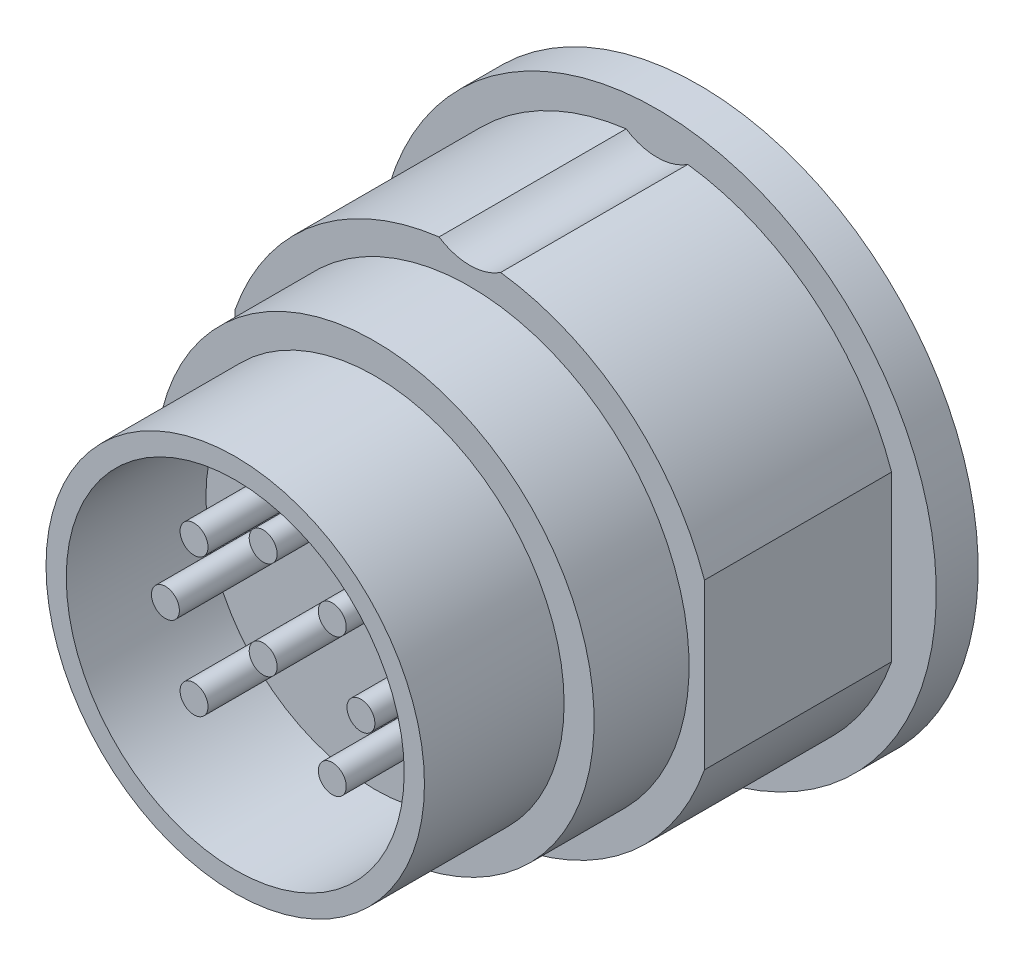
ISO-10303-21;
HEADER;
FILE_DESCRIPTION(('STEP AP214'),'2;1');
FILE_NAME('part.step','',(''),(''),'','','');
FILE_SCHEMA(('AUTOMOTIVE_DESIGN { 1 0 10303 214 1 1 1 1 }'));
ENDSEC;
DATA;
#1=APPLICATION_CONTEXT('core data for automotive mechanical design processes');
#2=APPLICATION_PROTOCOL_DEFINITION('international standard','automotive_design',2000,#1);
#3=PRODUCT_CONTEXT('',#1,'mechanical');
#4=PRODUCT('Part','Part','',(#3));
#5=PRODUCT_RELATED_PRODUCT_CATEGORY('part','',(#4));
#6=PRODUCT_DEFINITION_FORMATION('','',#4);
#7=PRODUCT_DEFINITION_CONTEXT('part definition',#1,'design');
#8=PRODUCT_DEFINITION('design','',#6,#7);
#9=PRODUCT_DEFINITION_SHAPE('','',#8);
#10=(LENGTH_UNIT() NAMED_UNIT(*) SI_UNIT(.MILLI.,.METRE.));
#11=(NAMED_UNIT(*) PLANE_ANGLE_UNIT() SI_UNIT($,.RADIAN.));
#12=(NAMED_UNIT(*) SI_UNIT($,.STERADIAN.) SOLID_ANGLE_UNIT());
#13=UNCERTAINTY_MEASURE_WITH_UNIT(LENGTH_MEASURE(1.E-05),#10,'distance_accuracy_value','');
#14=(GEOMETRIC_REPRESENTATION_CONTEXT(3) GLOBAL_UNCERTAINTY_ASSIGNED_CONTEXT((#13)) GLOBAL_UNIT_ASSIGNED_CONTEXT((#10,
#11,#12)) REPRESENTATION_CONTEXT('',''));
#15=CARTESIAN_POINT('',(0.,0.,0.));
#16=DIRECTION('',(0.,0.,1.));
#17=DIRECTION('',(1.,0.,0.));
#18=AXIS2_PLACEMENT_3D('',#15,#16,#17);
#19=CARTESIAN_POINT('',(0.,0.,4.55));
#20=DIRECTION('',(0.,0.,-1.));
#21=DIRECTION('',(1.,0.,0.));
#22=AXIS2_PLACEMENT_3D('',#19,#20,#21);
#23=CYLINDRICAL_SURFACE('',#22,0.5);
#24=CARTESIAN_POINT('',(0.,0.,-0.45));
#25=DIRECTION('',(0.,0.,1.));
#26=DIRECTION('',(1.,0.,0.));
#27=AXIS2_PLACEMENT_3D('',#24,#25,#26);
#28=CIRCLE('',#27,0.5);
#29=CARTESIAN_POINT('',(0.5,0.,-0.45));
#30=VERTEX_POINT('',#29);
#31=EDGE_CURVE('E11',#30,#30,#28,.T.);
#32=ORIENTED_EDGE('',*,*,#31,.T.);
#33=EDGE_LOOP('',(#32));
#34=FACE_BOUND('',#33,.T.);
#35=CARTESIAN_POINT('',(0.,0.,4.55));
#36=DIRECTION('',(0.,0.,1.));
#37=DIRECTION('',(1.,0.,0.));
#38=AXIS2_PLACEMENT_3D('',#35,#36,#37);
#39=CIRCLE('',#38,0.5);
#40=CARTESIAN_POINT('',(0.5,0.,4.55));
#41=VERTEX_POINT('',#40);
#42=EDGE_CURVE('E109',#41,#41,#39,.T.);
#43=ORIENTED_EDGE('',*,*,#42,.F.);
#44=EDGE_LOOP('',(#43));
#45=FACE_BOUND('',#44,.T.);
#46=ADVANCED_FACE('F17',(#34,#45),#23,.T.);
#47=CARTESIAN_POINT('',(0.,0.,-0.45));
#48=DIRECTION('',(0.,0.,1.));
#49=DIRECTION('',(1.,0.,0.));
#50=AXIS2_PLACEMENT_3D('',#47,#48,#49);
#51=PLANE('',#50);
#52=ORIENTED_EDGE('',*,*,#31,.F.);
#53=EDGE_LOOP('',(#52));
#54=FACE_BOUND('',#53,.T.);
#55=ADVANCED_FACE('F173',(#54),#51,.F.);
#56=CARTESIAN_POINT('',(2.47487373415292,-2.47487373415292,4.55));
#57=DIRECTION('',(0.,0.,-1.));
#58=DIRECTION('',(1.,0.,0.));
#59=AXIS2_PLACEMENT_3D('',#56,#57,#58);
#60=CYLINDRICAL_SURFACE('',#59,0.5);
#61=CARTESIAN_POINT('',(2.47487373415292,-2.47487373415292,-0.45));
#62=DIRECTION('',(0.,0.,1.));
#63=DIRECTION('',(1.,0.,0.));
#64=AXIS2_PLACEMENT_3D('',#61,#62,#63);
#65=CIRCLE('',#64,0.5);
#66=CARTESIAN_POINT('',(2.97487373415292,-2.47487373415292,-0.45));
#67=VERTEX_POINT('',#66);
#68=EDGE_CURVE('E27',#67,#67,#65,.T.);
#69=ORIENTED_EDGE('',*,*,#68,.T.);
#70=EDGE_LOOP('',(#69));
#71=FACE_BOUND('',#70,.T.);
#72=CARTESIAN_POINT('',(2.47487373415292,-2.47487373415292,4.55));
#73=DIRECTION('',(0.,0.,1.));
#74=DIRECTION('',(1.,0.,0.));
#75=AXIS2_PLACEMENT_3D('',#72,#73,#74);
#76=CIRCLE('',#75,0.5);
#77=CARTESIAN_POINT('',(2.97487373415292,-2.47487373415292,4.55));
#78=VERTEX_POINT('',#77);
#79=EDGE_CURVE('E356',#78,#78,#76,.T.);
#80=ORIENTED_EDGE('',*,*,#79,.F.);
#81=EDGE_LOOP('',(#80));
#82=FACE_BOUND('',#81,.T.);
#83=ADVANCED_FACE('F179',(#71,#82),#60,.T.);
#84=CARTESIAN_POINT('',(2.47487373415292,-2.47487373415292,-0.45));
#85=DIRECTION('',(0.,0.,1.));
#86=DIRECTION('',(1.,0.,0.));
#87=AXIS2_PLACEMENT_3D('',#84,#85,#86);
#88=PLANE('',#87);
#89=ORIENTED_EDGE('',*,*,#68,.F.);
#90=EDGE_LOOP('',(#89));
#91=FACE_BOUND('',#90,.T.);
#92=ADVANCED_FACE('F186',(#91),#88,.F.);
#93=CARTESIAN_POINT('',(3.5,0.,4.55));
#94=DIRECTION('',(0.,0.,-1.));
#95=DIRECTION('',(1.,0.,0.));
#96=AXIS2_PLACEMENT_3D('',#93,#94,#95);
#97=CYLINDRICAL_SURFACE('',#96,0.5);
#98=CARTESIAN_POINT('',(3.5,0.,-0.45));
#99=DIRECTION('',(0.,0.,1.));
#100=DIRECTION('',(1.,0.,0.));
#101=AXIS2_PLACEMENT_3D('',#98,#99,#100);
#102=CIRCLE('',#101,0.5);
#103=CARTESIAN_POINT('',(4.,0.,-0.45));
#104=VERTEX_POINT('',#103);
#105=EDGE_CURVE('E500',#104,#104,#102,.T.);
#106=ORIENTED_EDGE('',*,*,#105,.T.);
#107=EDGE_LOOP('',(#106));
#108=FACE_BOUND('',#107,.T.);
#109=CARTESIAN_POINT('',(3.5,0.,4.55));
#110=DIRECTION('',(0.,0.,1.));
#111=DIRECTION('',(1.,0.,0.));
#112=AXIS2_PLACEMENT_3D('',#109,#110,#111);
#113=CIRCLE('',#112,0.5);
#114=CARTESIAN_POINT('',(4.,0.,4.55));
#115=VERTEX_POINT('',#114);
#116=EDGE_CURVE('E360',#115,#115,#113,.T.);
#117=ORIENTED_EDGE('',*,*,#116,.F.);
#118=EDGE_LOOP('',(#117));
#119=FACE_BOUND('',#118,.T.);
#120=ADVANCED_FACE('F190',(#108,#119),#97,.T.);
#121=CARTESIAN_POINT('',(3.5,0.,-0.45));
#122=DIRECTION('',(0.,0.,1.));
#123=DIRECTION('',(1.,0.,0.));
#124=AXIS2_PLACEMENT_3D('',#121,#122,#123);
#125=PLANE('',#124);
#126=ORIENTED_EDGE('',*,*,#105,.F.);
#127=EDGE_LOOP('',(#126));
#128=FACE_BOUND('',#127,.T.);
#129=ADVANCED_FACE('F194',(#128),#125,.F.);
#130=CARTESIAN_POINT('',(2.47487373415292,2.47487373415292,4.55));
#131=DIRECTION('',(0.,0.,-1.));
#132=DIRECTION('',(1.,0.,0.));
#133=AXIS2_PLACEMENT_3D('',#130,#131,#132);
#134=CYLINDRICAL_SURFACE('',#133,0.5);
#135=CARTESIAN_POINT('',(2.47487373415292,2.47487373415292,-0.45));
#136=DIRECTION('',(0.,0.,1.));
#137=DIRECTION('',(1.,0.,0.));
#138=AXIS2_PLACEMENT_3D('',#135,#136,#137);
#139=CIRCLE('',#138,0.5);
#140=CARTESIAN_POINT('',(2.97487373415292,2.47487373415292,-0.45));
#141=VERTEX_POINT('',#140);
#142=EDGE_CURVE('E496',#141,#141,#139,.T.);
#143=ORIENTED_EDGE('',*,*,#142,.T.);
#144=EDGE_LOOP('',(#143));
#145=FACE_BOUND('',#144,.T.);
#146=CARTESIAN_POINT('',(2.47487373415292,2.47487373415292,4.55));
#147=DIRECTION('',(0.,0.,1.));
#148=DIRECTION('',(1.,0.,0.));
#149=AXIS2_PLACEMENT_3D('',#146,#147,#148);
#150=CIRCLE('',#149,0.5);
#151=CARTESIAN_POINT('',(2.97487373415292,2.47487373415292,4.55));
#152=VERTEX_POINT('',#151);
#153=EDGE_CURVE('E364',#152,#152,#150,.T.);
#154=ORIENTED_EDGE('',*,*,#153,.F.);
#155=EDGE_LOOP('',(#154));
#156=FACE_BOUND('',#155,.T.);
#157=ADVANCED_FACE('F198',(#145,#156),#134,.T.);
#158=CARTESIAN_POINT('',(2.47487373415292,2.47487373415292,-0.45));
#159=DIRECTION('',(0.,0.,1.));
#160=DIRECTION('',(1.,0.,0.));
#161=AXIS2_PLACEMENT_3D('',#158,#159,#160);
#162=PLANE('',#161);
#163=ORIENTED_EDGE('',*,*,#142,.F.);
#164=EDGE_LOOP('',(#163));
#165=FACE_BOUND('',#164,.T.);
#166=ADVANCED_FACE('F202',(#165),#162,.F.);
#167=CARTESIAN_POINT('',(0.,3.5,4.55));
#168=DIRECTION('',(0.,0.,-1.));
#169=DIRECTION('',(1.,0.,0.));
#170=AXIS2_PLACEMENT_3D('',#167,#168,#169);
#171=CYLINDRICAL_SURFACE('',#170,0.5);
#172=CARTESIAN_POINT('',(0.,3.5,-0.45));
#173=DIRECTION('',(0.,0.,1.));
#174=DIRECTION('',(1.,0.,0.));
#175=AXIS2_PLACEMENT_3D('',#172,#173,#174);
#176=CIRCLE('',#175,0.5);
#177=CARTESIAN_POINT('',(0.5,3.5,-0.45));
#178=VERTEX_POINT('',#177);
#179=EDGE_CURVE('E489',#178,#178,#176,.T.);
#180=ORIENTED_EDGE('',*,*,#179,.T.);
#181=EDGE_LOOP('',(#180));
#182=FACE_BOUND('',#181,.T.);
#183=CARTESIAN_POINT('',(0.,3.5,4.55));
#184=DIRECTION('',(0.,0.,1.));
#185=DIRECTION('',(1.,0.,0.));
#186=AXIS2_PLACEMENT_3D('',#183,#184,#185);
#187=CIRCLE('',#186,0.5);
#188=CARTESIAN_POINT('',(0.5,3.5,4.55));
#189=VERTEX_POINT('',#188);
#190=EDGE_CURVE('E368',#189,#189,#187,.T.);
#191=ORIENTED_EDGE('',*,*,#190,.F.);
#192=EDGE_LOOP('',(#191));
#193=FACE_BOUND('',#192,.T.);
#194=ADVANCED_FACE('F206',(#182,#193),#171,.T.);
#195=CARTESIAN_POINT('',(0.,3.5,-0.45));
#196=DIRECTION('',(0.,0.,1.));
#197=DIRECTION('',(1.,0.,0.));
#198=AXIS2_PLACEMENT_3D('',#195,#196,#197);
#199=PLANE('',#198);
#200=ORIENTED_EDGE('',*,*,#179,.F.);
#201=EDGE_LOOP('',(#200));
#202=FACE_BOUND('',#201,.T.);
#203=ADVANCED_FACE('F210',(#202),#199,.F.);
#204=CARTESIAN_POINT('',(-2.47487373415292,2.47487373415292,4.55));
#205=DIRECTION('',(0.,0.,-1.));
#206=DIRECTION('',(1.,0.,0.));
#207=AXIS2_PLACEMENT_3D('',#204,#205,#206);
#208=CYLINDRICAL_SURFACE('',#207,0.5);
#209=CARTESIAN_POINT('',(-2.47487373415292,2.47487373415292,-0.45));
#210=DIRECTION('',(0.,0.,1.));
#211=DIRECTION('',(1.,0.,0.));
#212=AXIS2_PLACEMENT_3D('',#209,#210,#211);
#213=CIRCLE('',#212,0.5);
#214=CARTESIAN_POINT('',(-1.97487373415292,2.47487373415292,-0.45));
#215=VERTEX_POINT('',#214);
#216=EDGE_CURVE('E485',#215,#215,#213,.T.);
#217=ORIENTED_EDGE('',*,*,#216,.T.);
#218=EDGE_LOOP('',(#217));
#219=FACE_BOUND('',#218,.T.);
#220=CARTESIAN_POINT('',(-2.47487373415292,2.47487373415292,4.55));
#221=DIRECTION('',(0.,0.,1.));
#222=DIRECTION('',(1.,0.,0.));
#223=AXIS2_PLACEMENT_3D('',#220,#221,#222);
#224=CIRCLE('',#223,0.5);
#225=CARTESIAN_POINT('',(-1.97487373415292,2.47487373415292,4.55));
#226=VERTEX_POINT('',#225);
#227=EDGE_CURVE('E372',#226,#226,#224,.T.);
#228=ORIENTED_EDGE('',*,*,#227,.F.);
#229=EDGE_LOOP('',(#228));
#230=FACE_BOUND('',#229,.T.);
#231=ADVANCED_FACE('F214',(#219,#230),#208,.T.);
#232=CARTESIAN_POINT('',(-2.47487373415292,2.47487373415292,-0.45));
#233=DIRECTION('',(0.,0.,1.));
#234=DIRECTION('',(1.,0.,0.));
#235=AXIS2_PLACEMENT_3D('',#232,#233,#234);
#236=PLANE('',#235);
#237=ORIENTED_EDGE('',*,*,#216,.F.);
#238=EDGE_LOOP('',(#237));
#239=FACE_BOUND('',#238,.T.);
#240=ADVANCED_FACE('F218',(#239),#236,.F.);
#241=CARTESIAN_POINT('',(-3.5,0.,4.55));
#242=DIRECTION('',(0.,0.,-1.));
#243=DIRECTION('',(1.,0.,0.));
#244=AXIS2_PLACEMENT_3D('',#241,#242,#243);
#245=CYLINDRICAL_SURFACE('',#244,0.5);
#246=CARTESIAN_POINT('',(-3.5,0.,-0.45));
#247=DIRECTION('',(0.,0.,1.));
#248=DIRECTION('',(1.,0.,0.));
#249=AXIS2_PLACEMENT_3D('',#246,#247,#248);
#250=CIRCLE('',#249,0.5);
#251=CARTESIAN_POINT('',(-3.,0.,-0.45));
#252=VERTEX_POINT('',#251);
#253=EDGE_CURVE('E482',#252,#252,#250,.T.);
#254=ORIENTED_EDGE('',*,*,#253,.T.);
#255=EDGE_LOOP('',(#254));
#256=FACE_BOUND('',#255,.T.);
#257=CARTESIAN_POINT('',(-3.5,0.,4.55));
#258=DIRECTION('',(0.,0.,1.));
#259=DIRECTION('',(1.,0.,0.));
#260=AXIS2_PLACEMENT_3D('',#257,#258,#259);
#261=CIRCLE('',#260,0.5);
#262=CARTESIAN_POINT('',(-3.,0.,4.55));
#263=VERTEX_POINT('',#262);
#264=EDGE_CURVE('E376',#263,#263,#261,.T.);
#265=ORIENTED_EDGE('',*,*,#264,.F.);
#266=EDGE_LOOP('',(#265));
#267=FACE_BOUND('',#266,.T.);
#268=ADVANCED_FACE('F222',(#256,#267),#245,.T.);
#269=CARTESIAN_POINT('',(-3.5,0.,-0.45));
#270=DIRECTION('',(0.,0.,1.));
#271=DIRECTION('',(1.,0.,0.));
#272=AXIS2_PLACEMENT_3D('',#269,#270,#271);
#273=PLANE('',#272);
#274=ORIENTED_EDGE('',*,*,#253,.F.);
#275=EDGE_LOOP('',(#274));
#276=FACE_BOUND('',#275,.T.);
#277=ADVANCED_FACE('F226',(#276),#273,.F.);
#278=CARTESIAN_POINT('',(-2.47487373415292,-2.47487373415292,4.55));
#279=DIRECTION('',(0.,0.,-1.));
#280=DIRECTION('',(1.,0.,0.));
#281=AXIS2_PLACEMENT_3D('',#278,#279,#280);
#282=CYLINDRICAL_SURFACE('',#281,0.5);
#283=CARTESIAN_POINT('',(-2.47487373415292,-2.47487373415292,-0.45));
#284=DIRECTION('',(0.,0.,1.));
#285=DIRECTION('',(1.,0.,0.));
#286=AXIS2_PLACEMENT_3D('',#283,#284,#285);
#287=CIRCLE('',#286,0.5);
#288=CARTESIAN_POINT('',(-1.97487373415292,-2.47487373415292,-0.45));
#289=VERTEX_POINT('',#288);
#290=EDGE_CURVE('E388',#289,#289,#287,.T.);
#291=ORIENTED_EDGE('',*,*,#290,.T.);
#292=EDGE_LOOP('',(#291));
#293=FACE_BOUND('',#292,.T.);
#294=CARTESIAN_POINT('',(-2.47487373415292,-2.47487373415292,4.55));
#295=DIRECTION('',(0.,0.,1.));
#296=DIRECTION('',(1.,0.,0.));
#297=AXIS2_PLACEMENT_3D('',#294,#295,#296);
#298=CIRCLE('',#297,0.5);
#299=CARTESIAN_POINT('',(-1.97487373415292,-2.47487373415292,4.55));
#300=VERTEX_POINT('',#299);
#301=EDGE_CURVE('E379',#300,#300,#298,.T.);
#302=ORIENTED_EDGE('',*,*,#301,.F.);
#303=EDGE_LOOP('',(#302));
#304=FACE_BOUND('',#303,.T.);
#305=ADVANCED_FACE('F230',(#293,#304),#282,.T.);
#306=CARTESIAN_POINT('',(-2.47487373415292,-2.47487373415292,-0.45));
#307=DIRECTION('',(0.,0.,1.));
#308=DIRECTION('',(1.,0.,0.));
#309=AXIS2_PLACEMENT_3D('',#306,#307,#308);
#310=PLANE('',#309);
#311=ORIENTED_EDGE('',*,*,#290,.F.);
#312=EDGE_LOOP('',(#311));
#313=FACE_BOUND('',#312,.T.);
#314=ADVANCED_FACE('F234',(#313),#310,.F.);
#315=CARTESIAN_POINT('',(0.,0.,11.6));
#316=DIRECTION('',(0.,0.,1.));
#317=DIRECTION('',(-1.,0.,0.));
#318=AXIS2_PLACEMENT_3D('',#315,#316,#317);
#319=CYLINDRICAL_SURFACE('',#318,6.05);
#320=CARTESIAN_POINT('',(0.,0.,16.6));
#321=DIRECTION('',(0.,0.,-1.));
#322=DIRECTION('',(-1.,0.,0.));
#323=AXIS2_PLACEMENT_3D('',#320,#321,#322);
#324=CIRCLE('',#323,6.05);
#325=CARTESIAN_POINT('',(-6.05,0.,16.6));
#326=VERTEX_POINT('',#325);
#327=EDGE_CURVE('E389',#326,#326,#324,.T.);
#328=ORIENTED_EDGE('',*,*,#327,.F.);
#329=EDGE_LOOP('',(#328));
#330=FACE_BOUND('',#329,.T.);
#331=CARTESIAN_POINT('',(0.,0.,11.6));
#332=DIRECTION('',(0.,0.,1.));
#333=DIRECTION('',(-1.,0.,0.));
#334=AXIS2_PLACEMENT_3D('',#331,#332,#333);
#335=CIRCLE('',#334,6.05);
#336=CARTESIAN_POINT('',(-6.05,0.,11.6));
#337=VERTEX_POINT('',#336);
#338=EDGE_CURVE('E384',#337,#337,#335,.T.);
#339=ORIENTED_EDGE('',*,*,#338,.F.);
#340=EDGE_LOOP('',(#339));
#341=FACE_BOUND('',#340,.T.);
#342=ADVANCED_FACE('F238',(#330,#341),#319,.F.);
#343=CARTESIAN_POINT('',(0.,0.,11.6));
#344=DIRECTION('',(0.,0.,1.));
#345=DIRECTION('',(-1.,0.,0.));
#346=AXIS2_PLACEMENT_3D('',#343,#344,#345);
#347=CYLINDRICAL_SURFACE('',#346,6.775);
#348=CARTESIAN_POINT('',(0.,0.,16.6));
#349=DIRECTION('',(0.,0.,-1.));
#350=DIRECTION('',(-1.,0.,0.));
#351=AXIS2_PLACEMENT_3D('',#348,#349,#350);
#352=CIRCLE('',#351,6.775);
#353=CARTESIAN_POINT('',(-6.775,0.,16.6));
#354=VERTEX_POINT('',#353);
#355=EDGE_CURVE('E392',#354,#354,#352,.T.);
#356=ORIENTED_EDGE('',*,*,#355,.T.);
#357=EDGE_LOOP('',(#356));
#358=FACE_BOUND('',#357,.T.);
#359=CARTESIAN_POINT('',(0.,0.,11.6));
#360=DIRECTION('',(0.,0.,-1.));
#361=DIRECTION('',(-1.,0.,0.));
#362=AXIS2_PLACEMENT_3D('',#359,#360,#361);
#363=CIRCLE('',#362,6.775);
#364=CARTESIAN_POINT('',(-6.775,0.,11.6));
#365=VERTEX_POINT('',#364);
#366=EDGE_CURVE('E393',#365,#365,#363,.T.);
#367=ORIENTED_EDGE('',*,*,#366,.F.);
#368=EDGE_LOOP('',(#367));
#369=FACE_BOUND('',#368,.T.);
#370=ADVANCED_FACE('F242',(#358,#369),#347,.T.);
#371=CARTESIAN_POINT('',(0.,0.,16.6));
#372=DIRECTION('',(0.,0.,-1.));
#373=DIRECTION('',(-1.,0.,0.));
#374=AXIS2_PLACEMENT_3D('',#371,#372,#373);
#375=PLANE('',#374);
#376=ORIENTED_EDGE('',*,*,#355,.F.);
#377=EDGE_LOOP('',(#376));
#378=FACE_BOUND('',#377,.T.);
#379=ORIENTED_EDGE('',*,*,#327,.T.);
#380=EDGE_LOOP('',(#379));
#381=FACE_BOUND('',#380,.T.);
#382=ADVANCED_FACE('F246',(#378,#381),#375,.F.);
#383=CARTESIAN_POINT('',(0.,0.,11.6));
#384=DIRECTION('',(0.,0.,-1.));
#385=DIRECTION('',(-1.,0.,0.));
#386=AXIS2_PLACEMENT_3D('',#383,#384,#385);
#387=PLANE('',#386);
#388=CARTESIAN_POINT('',(0.,0.,11.6));
#389=DIRECTION('',(0.,0.,-1.));
#390=DIRECTION('',(-1.,0.,0.));
#391=AXIS2_PLACEMENT_3D('',#388,#389,#390);
#392=CIRCLE('',#391,7.85);
#393=CARTESIAN_POINT('',(-7.85,0.,11.6));
#394=VERTEX_POINT('',#393);
#395=EDGE_CURVE('E381',#394,#394,#392,.T.);
#396=ORIENTED_EDGE('',*,*,#395,.F.);
#397=EDGE_LOOP('',(#396));
#398=FACE_BOUND('',#397,.T.);
#399=ORIENTED_EDGE('',*,*,#366,.T.);
#400=EDGE_LOOP('',(#399));
#401=FACE_BOUND('',#400,.T.);
#402=ADVANCED_FACE('F250',(#398,#401),#387,.F.);
#403=CARTESIAN_POINT('',(-2.47487373415292,-2.47487373415292,11.6));
#404=DIRECTION('',(0.,0.,1.));
#405=DIRECTION('',(-1.,0.,0.));
#406=AXIS2_PLACEMENT_3D('',#403,#404,#405);
#407=CYLINDRICAL_SURFACE('',#406,0.5);
#408=CARTESIAN_POINT('',(-2.47487373415292,-2.47487373415292,15.6));
#409=DIRECTION('',(0.,0.,-1.));
#410=DIRECTION('',(-1.,0.,0.));
#411=AXIS2_PLACEMENT_3D('',#408,#409,#410);
#412=CIRCLE('',#411,0.5);
#413=CARTESIAN_POINT('',(-2.97487373415292,-2.47487373415292,15.6));
#414=VERTEX_POINT('',#413);
#415=EDGE_CURVE('E400',#414,#414,#412,.T.);
#416=ORIENTED_EDGE('',*,*,#415,.T.);
#417=EDGE_LOOP('',(#416));
#418=FACE_BOUND('',#417,.T.);
#419=CARTESIAN_POINT('',(-2.47487373415292,-2.47487373415292,11.6));
#420=DIRECTION('',(0.,0.,-1.));
#421=DIRECTION('',(-1.,0.,0.));
#422=AXIS2_PLACEMENT_3D('',#419,#420,#421);
#423=CIRCLE('',#422,0.5);
#424=CARTESIAN_POINT('',(-2.97487373415292,-2.47487373415292,11.6));
#425=VERTEX_POINT('',#424);
#426=EDGE_CURVE('E396',#425,#425,#423,.T.);
#427=ORIENTED_EDGE('',*,*,#426,.F.);
#428=EDGE_LOOP('',(#427));
#429=FACE_BOUND('',#428,.T.);
#430=ADVANCED_FACE('F254',(#418,#429),#407,.T.);
#431=CARTESIAN_POINT('',(-2.47487373415292,-2.47487373415292,15.6));
#432=DIRECTION('',(0.,0.,-1.));
#433=DIRECTION('',(-1.,0.,0.));
#434=AXIS2_PLACEMENT_3D('',#431,#432,#433);
#435=PLANE('',#434);
#436=ORIENTED_EDGE('',*,*,#415,.F.);
#437=EDGE_LOOP('',(#436));
#438=FACE_BOUND('',#437,.T.);
#439=ADVANCED_FACE('F258',(#438),#435,.F.);
#440=CARTESIAN_POINT('',(-3.5,0.,11.6));
#441=DIRECTION('',(0.,0.,1.));
#442=DIRECTION('',(-1.,0.,0.));
#443=AXIS2_PLACEMENT_3D('',#440,#441,#442);
#444=CYLINDRICAL_SURFACE('',#443,0.5);
#445=CARTESIAN_POINT('',(-3.5,0.,15.6));
#446=DIRECTION('',(0.,0.,-1.));
#447=DIRECTION('',(-1.,0.,0.));
#448=AXIS2_PLACEMENT_3D('',#445,#446,#447);
#449=CIRCLE('',#448,0.5);
#450=CARTESIAN_POINT('',(-4.,0.,15.6));
#451=VERTEX_POINT('',#450);
#452=EDGE_CURVE('E404',#451,#451,#449,.T.);
#453=ORIENTED_EDGE('',*,*,#452,.T.);
#454=EDGE_LOOP('',(#453));
#455=FACE_BOUND('',#454,.T.);
#456=CARTESIAN_POINT('',(-3.5,0.,11.6));
#457=DIRECTION('',(0.,0.,-1.));
#458=DIRECTION('',(-1.,0.,0.));
#459=AXIS2_PLACEMENT_3D('',#456,#457,#458);
#460=CIRCLE('',#459,0.5);
#461=CARTESIAN_POINT('',(-4.,0.,11.6));
#462=VERTEX_POINT('',#461);
#463=EDGE_CURVE('E407',#462,#462,#460,.T.);
#464=ORIENTED_EDGE('',*,*,#463,.F.);
#465=EDGE_LOOP('',(#464));
#466=FACE_BOUND('',#465,.T.);
#467=ADVANCED_FACE('F262',(#455,#466),#444,.T.);
#468=CARTESIAN_POINT('',(-3.5,0.,15.6));
#469=DIRECTION('',(0.,0.,-1.));
#470=DIRECTION('',(-1.,0.,0.));
#471=AXIS2_PLACEMENT_3D('',#468,#469,#470);
#472=PLANE('',#471);
#473=ORIENTED_EDGE('',*,*,#452,.F.);
#474=EDGE_LOOP('',(#473));
#475=FACE_BOUND('',#474,.T.);
#476=ADVANCED_FACE('F266',(#475),#472,.F.);
#477=CARTESIAN_POINT('',(-2.47487373415292,2.47487373415292,11.6));
#478=DIRECTION('',(0.,0.,1.));
#479=DIRECTION('',(-1.,0.,0.));
#480=AXIS2_PLACEMENT_3D('',#477,#478,#479);
#481=CYLINDRICAL_SURFACE('',#480,0.5);
#482=CARTESIAN_POINT('',(-2.47487373415292,2.47487373415292,15.6));
#483=DIRECTION('',(0.,0.,-1.));
#484=DIRECTION('',(-1.,0.,0.));
#485=AXIS2_PLACEMENT_3D('',#482,#483,#484);
#486=CIRCLE('',#485,0.5);
#487=CARTESIAN_POINT('',(-2.97487373415292,2.47487373415292,15.6));
#488=VERTEX_POINT('',#487);
#489=EDGE_CURVE('E410',#488,#488,#486,.T.);
#490=ORIENTED_EDGE('',*,*,#489,.T.);
#491=EDGE_LOOP('',(#490));
#492=FACE_BOUND('',#491,.T.);
#493=CARTESIAN_POINT('',(-2.47487373415292,2.47487373415292,11.6));
#494=DIRECTION('',(0.,0.,-1.));
#495=DIRECTION('',(-1.,0.,0.));
#496=AXIS2_PLACEMENT_3D('',#493,#494,#495);
#497=CIRCLE('',#496,0.5);
#498=CARTESIAN_POINT('',(-2.97487373415292,2.47487373415292,11.6));
#499=VERTEX_POINT('',#498);
#500=EDGE_CURVE('E413',#499,#499,#497,.T.);
#501=ORIENTED_EDGE('',*,*,#500,.F.);
#502=EDGE_LOOP('',(#501));
#503=FACE_BOUND('',#502,.T.);
#504=ADVANCED_FACE('F270',(#492,#503),#481,.T.);
#505=CARTESIAN_POINT('',(-2.47487373415292,2.47487373415292,15.6));
#506=DIRECTION('',(0.,0.,-1.));
#507=DIRECTION('',(-1.,0.,0.));
#508=AXIS2_PLACEMENT_3D('',#505,#506,#507);
#509=PLANE('',#508);
#510=ORIENTED_EDGE('',*,*,#489,.F.);
#511=EDGE_LOOP('',(#510));
#512=FACE_BOUND('',#511,.T.);
#513=ADVANCED_FACE('F274',(#512),#509,.F.);
#514=CARTESIAN_POINT('',(0.,3.5,11.6));
#515=DIRECTION('',(0.,0.,1.));
#516=DIRECTION('',(-1.,0.,0.));
#517=AXIS2_PLACEMENT_3D('',#514,#515,#516);
#518=CYLINDRICAL_SURFACE('',#517,0.5);
#519=CARTESIAN_POINT('',(0.,3.5,15.6));
#520=DIRECTION('',(0.,0.,-1.));
#521=DIRECTION('',(-1.,0.,0.));
#522=AXIS2_PLACEMENT_3D('',#519,#520,#521);
#523=CIRCLE('',#522,0.5);
#524=CARTESIAN_POINT('',(-0.5,3.5,15.6));
#525=VERTEX_POINT('',#524);
#526=EDGE_CURVE('E416',#525,#525,#523,.T.);
#527=ORIENTED_EDGE('',*,*,#526,.T.);
#528=EDGE_LOOP('',(#527));
#529=FACE_BOUND('',#528,.T.);
#530=CARTESIAN_POINT('',(0.,3.5,11.6));
#531=DIRECTION('',(0.,0.,-1.));
#532=DIRECTION('',(-1.,0.,0.));
#533=AXIS2_PLACEMENT_3D('',#530,#531,#532);
#534=CIRCLE('',#533,0.5);
#535=CARTESIAN_POINT('',(-0.5,3.5,11.6));
#536=VERTEX_POINT('',#535);
#537=EDGE_CURVE('E419',#536,#536,#534,.T.);
#538=ORIENTED_EDGE('',*,*,#537,.F.);
#539=EDGE_LOOP('',(#538));
#540=FACE_BOUND('',#539,.T.);
#541=ADVANCED_FACE('F278',(#529,#540),#518,.T.);
#542=CARTESIAN_POINT('',(0.,3.5,15.6));
#543=DIRECTION('',(0.,0.,-1.));
#544=DIRECTION('',(-1.,0.,0.));
#545=AXIS2_PLACEMENT_3D('',#542,#543,#544);
#546=PLANE('',#545);
#547=ORIENTED_EDGE('',*,*,#526,.F.);
#548=EDGE_LOOP('',(#547));
#549=FACE_BOUND('',#548,.T.);
#550=ADVANCED_FACE('F282',(#549),#546,.F.);
#551=CARTESIAN_POINT('',(2.47487373415292,2.47487373415292,11.6));
#552=DIRECTION('',(0.,0.,1.));
#553=DIRECTION('',(-1.,0.,0.));
#554=AXIS2_PLACEMENT_3D('',#551,#552,#553);
#555=CYLINDRICAL_SURFACE('',#554,0.5);
#556=CARTESIAN_POINT('',(2.47487373415292,2.47487373415292,15.6));
#557=DIRECTION('',(0.,0.,-1.));
#558=DIRECTION('',(-1.,0.,0.));
#559=AXIS2_PLACEMENT_3D('',#556,#557,#558);
#560=CIRCLE('',#559,0.5);
#561=CARTESIAN_POINT('',(1.97487373415292,2.47487373415292,15.6));
#562=VERTEX_POINT('',#561);
#563=EDGE_CURVE('E422',#562,#562,#560,.T.);
#564=ORIENTED_EDGE('',*,*,#563,.T.);
#565=EDGE_LOOP('',(#564));
#566=FACE_BOUND('',#565,.T.);
#567=CARTESIAN_POINT('',(2.47487373415292,2.47487373415292,11.6));
#568=DIRECTION('',(0.,0.,-1.));
#569=DIRECTION('',(-1.,0.,0.));
#570=AXIS2_PLACEMENT_3D('',#567,#568,#569);
#571=CIRCLE('',#570,0.5);
#572=CARTESIAN_POINT('',(1.97487373415292,2.47487373415292,11.6));
#573=VERTEX_POINT('',#572);
#574=EDGE_CURVE('E425',#573,#573,#571,.T.);
#575=ORIENTED_EDGE('',*,*,#574,.F.);
#576=EDGE_LOOP('',(#575));
#577=FACE_BOUND('',#576,.T.);
#578=ADVANCED_FACE('F286',(#566,#577),#555,.T.);
#579=CARTESIAN_POINT('',(2.47487373415292,2.47487373415292,15.6));
#580=DIRECTION('',(0.,0.,-1.));
#581=DIRECTION('',(-1.,0.,0.));
#582=AXIS2_PLACEMENT_3D('',#579,#580,#581);
#583=PLANE('',#582);
#584=ORIENTED_EDGE('',*,*,#563,.F.);
#585=EDGE_LOOP('',(#584));
#586=FACE_BOUND('',#585,.T.);
#587=ADVANCED_FACE('F290',(#586),#583,.F.);
#588=CARTESIAN_POINT('',(3.5,0.,11.6));
#589=DIRECTION('',(0.,0.,1.));
#590=DIRECTION('',(-1.,0.,0.));
#591=AXIS2_PLACEMENT_3D('',#588,#589,#590);
#592=CYLINDRICAL_SURFACE('',#591,0.5);
#593=CARTESIAN_POINT('',(3.5,0.,15.6));
#594=DIRECTION('',(0.,0.,-1.));
#595=DIRECTION('',(-1.,0.,0.));
#596=AXIS2_PLACEMENT_3D('',#593,#594,#595);
#597=CIRCLE('',#596,0.5);
#598=CARTESIAN_POINT('',(3.,0.,15.6));
#599=VERTEX_POINT('',#598);
#600=EDGE_CURVE('E428',#599,#599,#597,.T.);
#601=ORIENTED_EDGE('',*,*,#600,.T.);
#602=EDGE_LOOP('',(#601));
#603=FACE_BOUND('',#602,.T.);
#604=CARTESIAN_POINT('',(3.5,0.,11.6));
#605=DIRECTION('',(0.,0.,-1.));
#606=DIRECTION('',(-1.,0.,0.));
#607=AXIS2_PLACEMENT_3D('',#604,#605,#606);
#608=CIRCLE('',#607,0.5);
#609=CARTESIAN_POINT('',(3.,0.,11.6));
#610=VERTEX_POINT('',#609);
#611=EDGE_CURVE('E431',#610,#610,#608,.T.);
#612=ORIENTED_EDGE('',*,*,#611,.F.);
#613=EDGE_LOOP('',(#612));
#614=FACE_BOUND('',#613,.T.);
#615=ADVANCED_FACE('F294',(#603,#614),#592,.T.);
#616=CARTESIAN_POINT('',(3.5,0.,15.6));
#617=DIRECTION('',(0.,0.,-1.));
#618=DIRECTION('',(-1.,0.,0.));
#619=AXIS2_PLACEMENT_3D('',#616,#617,#618);
#620=PLANE('',#619);
#621=ORIENTED_EDGE('',*,*,#600,.F.);
#622=EDGE_LOOP('',(#621));
#623=FACE_BOUND('',#622,.T.);
#624=ADVANCED_FACE('F298',(#623),#620,.F.);
#625=CARTESIAN_POINT('',(2.47487373415292,-2.47487373415292,11.6));
#626=DIRECTION('',(0.,0.,1.));
#627=DIRECTION('',(-1.,0.,0.));
#628=AXIS2_PLACEMENT_3D('',#625,#626,#627);
#629=CYLINDRICAL_SURFACE('',#628,0.5);
#630=CARTESIAN_POINT('',(2.47487373415292,-2.47487373415292,15.6));
#631=DIRECTION('',(0.,0.,-1.));
#632=DIRECTION('',(-1.,0.,0.));
#633=AXIS2_PLACEMENT_3D('',#630,#631,#632);
#634=CIRCLE('',#633,0.5);
#635=CARTESIAN_POINT('',(1.97487373415292,-2.47487373415292,15.6));
#636=VERTEX_POINT('',#635);
#637=EDGE_CURVE('E434',#636,#636,#634,.T.);
#638=ORIENTED_EDGE('',*,*,#637,.T.);
#639=EDGE_LOOP('',(#638));
#640=FACE_BOUND('',#639,.T.);
#641=CARTESIAN_POINT('',(2.47487373415292,-2.47487373415292,11.6));
#642=DIRECTION('',(0.,0.,-1.));
#643=DIRECTION('',(-1.,0.,0.));
#644=AXIS2_PLACEMENT_3D('',#641,#642,#643);
#645=CIRCLE('',#644,0.5);
#646=CARTESIAN_POINT('',(1.97487373415292,-2.47487373415292,11.6));
#647=VERTEX_POINT('',#646);
#648=EDGE_CURVE('E124',#647,#647,#645,.T.);
#649=ORIENTED_EDGE('',*,*,#648,.F.);
#650=EDGE_LOOP('',(#649));
#651=FACE_BOUND('',#650,.T.);
#652=ADVANCED_FACE('F302',(#640,#651),#629,.T.);
#653=CARTESIAN_POINT('',(2.47487373415292,-2.47487373415292,15.6));
#654=DIRECTION('',(0.,0.,-1.));
#655=DIRECTION('',(-1.,0.,0.));
#656=AXIS2_PLACEMENT_3D('',#653,#654,#655);
#657=PLANE('',#656);
#658=ORIENTED_EDGE('',*,*,#637,.F.);
#659=EDGE_LOOP('',(#658));
#660=FACE_BOUND('',#659,.T.);
#661=ADVANCED_FACE('F306',(#660),#657,.F.);
#662=CARTESIAN_POINT('',(0.,0.,11.6));
#663=DIRECTION('',(0.,0.,1.));
#664=DIRECTION('',(-1.,0.,0.));
#665=AXIS2_PLACEMENT_3D('',#662,#663,#664);
#666=CYLINDRICAL_SURFACE('',#665,0.5);
#667=CARTESIAN_POINT('',(0.,0.,15.6));
#668=DIRECTION('',(0.,0.,-1.));
#669=DIRECTION('',(-1.,0.,0.));
#670=AXIS2_PLACEMENT_3D('',#667,#668,#669);
#671=CIRCLE('',#670,0.5);
#672=CARTESIAN_POINT('',(-0.5,0.,15.6));
#673=VERTEX_POINT('',#672);
#674=EDGE_CURVE('E133',#673,#673,#671,.T.);
#675=ORIENTED_EDGE('',*,*,#674,.T.);
#676=EDGE_LOOP('',(#675));
#677=FACE_BOUND('',#676,.T.);
#678=CARTESIAN_POINT('',(0.,0.,11.6));
#679=DIRECTION('',(0.,0.,-1.));
#680=DIRECTION('',(-1.,0.,0.));
#681=AXIS2_PLACEMENT_3D('',#678,#679,#680);
#682=CIRCLE('',#681,0.5);
#683=CARTESIAN_POINT('',(-0.5,0.,11.6));
#684=VERTEX_POINT('',#683);
#685=EDGE_CURVE('E119',#684,#684,#682,.T.);
#686=ORIENTED_EDGE('',*,*,#685,.F.);
#687=EDGE_LOOP('',(#686));
#688=FACE_BOUND('',#687,.T.);
#689=ADVANCED_FACE('F310',(#677,#688),#666,.T.);
#690=CARTESIAN_POINT('',(0.,0.,15.6));
#691=DIRECTION('',(0.,0.,-1.));
#692=DIRECTION('',(-1.,0.,0.));
#693=AXIS2_PLACEMENT_3D('',#690,#691,#692);
#694=PLANE('',#693);
#695=ORIENTED_EDGE('',*,*,#674,.F.);
#696=EDGE_LOOP('',(#695));
#697=FACE_BOUND('',#696,.T.);
#698=ADVANCED_FACE('F314',(#697),#694,.F.);
#699=CARTESIAN_POINT('',(8.4,5.,8.2));
#700=DIRECTION('',(-1.,0.,0.));
#701=DIRECTION('',(0.,0.,1.));
#702=AXIS2_PLACEMENT_3D('',#699,#700,#701);
#703=PLANE('',#702);
#704=DIRECTION('',(0.,0.,1.));
#705=VECTOR('',#704,1.);
#706=CARTESIAN_POINT('',(8.4,-2.94108823397055,1.5));
#707=LINE('',#706,#705);
#708=CARTESIAN_POINT('',(8.4,-2.94108823397055,1.5));
#709=VERTEX_POINT('',#708);
#710=CARTESIAN_POINT('',(8.4,-2.94108823397055,8.2));
#711=VERTEX_POINT('',#710);
#712=EDGE_CURVE('E36',#709,#711,#707,.T.);
#713=ORIENTED_EDGE('',*,*,#712,.F.);
#714=DIRECTION('',(0.,-1.,0.));
#715=VECTOR('',#714,1.);
#716=CARTESIAN_POINT('',(8.4,2.94108823397056,1.5));
#717=LINE('',#716,#715);
#718=CARTESIAN_POINT('',(8.4,2.94108823397056,1.5));
#719=VERTEX_POINT('',#718);
#720=EDGE_CURVE('E140',#719,#709,#717,.T.);
#721=ORIENTED_EDGE('',*,*,#720,.F.);
#722=DIRECTION('',(0.,0.,-1.));
#723=VECTOR('',#722,1.);
#724=CARTESIAN_POINT('',(8.4,2.94108823397056,8.2));
#725=LINE('',#724,#723);
#726=CARTESIAN_POINT('',(8.4,2.94108823397056,8.2));
#727=VERTEX_POINT('',#726);
#728=EDGE_CURVE('E97',#727,#719,#725,.T.);
#729=ORIENTED_EDGE('',*,*,#728,.F.);
#730=DIRECTION('',(0.,1.,0.));
#731=VECTOR('',#730,1.);
#732=CARTESIAN_POINT('',(8.4,-2.94108823397055,8.2));
#733=LINE('',#732,#731);
#734=EDGE_CURVE('E90',#711,#727,#733,.T.);
#735=ORIENTED_EDGE('',*,*,#734,.F.);
#736=EDGE_LOOP('',(#713,#721,#729,#735));
#737=FACE_BOUND('',#736,.T.);
#738=ADVANCED_FACE('F318',(#737),#703,.F.);
#739=CARTESIAN_POINT('',(-8.4,-5.,8.2));
#740=DIRECTION('',(1.,0.,0.));
#741=DIRECTION('',(0.,0.,-1.));
#742=AXIS2_PLACEMENT_3D('',#739,#740,#741);
#743=PLANE('',#742);
#744=DIRECTION('',(0.,0.,-1.));
#745=VECTOR('',#744,1.);
#746=CARTESIAN_POINT('',(-8.4,-2.94108823397055,8.2));
#747=LINE('',#746,#745);
#748=CARTESIAN_POINT('',(-8.4,-2.94108823397055,8.2));
#749=VERTEX_POINT('',#748);
#750=CARTESIAN_POINT('',(-8.4,-2.94108823397055,1.5));
#751=VERTEX_POINT('',#750);
#752=EDGE_CURVE('E108',#749,#751,#747,.T.);
#753=ORIENTED_EDGE('',*,*,#752,.F.);
#754=DIRECTION('',(0.,-1.,0.));
#755=VECTOR('',#754,1.);
#756=CARTESIAN_POINT('',(-8.4,2.94108823397055,8.2));
#757=LINE('',#756,#755);
#758=CARTESIAN_POINT('',(-8.4,2.94108823397055,8.2));
#759=VERTEX_POINT('',#758);
#760=EDGE_CURVE('E91',#759,#749,#757,.T.);
#761=ORIENTED_EDGE('',*,*,#760,.F.);
#762=DIRECTION('',(0.,0.,1.));
#763=VECTOR('',#762,1.);
#764=CARTESIAN_POINT('',(-8.4,2.94108823397055,1.5));
#765=LINE('',#764,#763);
#766=CARTESIAN_POINT('',(-8.4,2.94108823397055,1.5));
#767=VERTEX_POINT('',#766);
#768=EDGE_CURVE('E80',#767,#759,#765,.T.);
#769=ORIENTED_EDGE('',*,*,#768,.F.);
#770=DIRECTION('',(0.,1.,0.));
#771=VECTOR('',#770,1.);
#772=CARTESIAN_POINT('',(-8.4,-2.94108823397055,1.5));
#773=LINE('',#772,#771);
#774=EDGE_CURVE('E128',#751,#767,#773,.T.);
#775=ORIENTED_EDGE('',*,*,#774,.F.);
#776=EDGE_LOOP('',(#753,#761,#769,#775));
#777=FACE_BOUND('',#776,.T.);
#778=ADVANCED_FACE('F322',(#777),#743,.F.);
#779=CARTESIAN_POINT('',(0.,0.,1.5));
#780=DIRECTION('',(0.,0.,-1.));
#781=DIRECTION('',(-1.,0.,0.));
#782=AXIS2_PLACEMENT_3D('',#779,#780,#781);
#783=PLANE('',#782);
#784=CARTESIAN_POINT('',(0.,0.,1.5));
#785=DIRECTION('',(0.,0.,-1.));
#786=DIRECTION('',(-1.,0.,0.));
#787=AXIS2_PLACEMENT_3D('',#784,#785,#786);
#788=CIRCLE('',#787,10.);
#789=CARTESIAN_POINT('',(-10.,0.,1.5));
#790=VERTEX_POINT('',#789);
#791=EDGE_CURVE('E115',#790,#790,#788,.T.);
#792=ORIENTED_EDGE('',*,*,#791,.F.);
#793=EDGE_LOOP('',(#792));
#794=FACE_BOUND('',#793,.T.);
#795=CARTESIAN_POINT('',(0.,0.,1.5));
#796=DIRECTION('',(0.,0.,-1.));
#797=DIRECTION('',(-1.,0.,0.));
#798=AXIS2_PLACEMENT_3D('',#795,#796,#797);
#799=CIRCLE('',#798,8.9);
#800=EDGE_CURVE('E130',#709,#751,#799,.T.);
#801=ORIENTED_EDGE('',*,*,#800,.T.);
#802=ORIENTED_EDGE('',*,*,#774,.T.);
#803=CARTESIAN_POINT('',(0.,0.,1.5));
#804=DIRECTION('',(0.,0.,-1.));
#805=DIRECTION('',(-1.,0.,0.));
#806=AXIS2_PLACEMENT_3D('',#803,#804,#805);
#807=CIRCLE('',#806,8.9);
#808=CARTESIAN_POINT('',(-1.10266467602581,8.83142857142857,1.5));
#809=VERTEX_POINT('',#808);
#810=EDGE_CURVE('E134',#767,#809,#807,.T.);
#811=ORIENTED_EDGE('',*,*,#810,.T.);
#812=CARTESIAN_POINT('',(0.,10.5,1.5));
#813=DIRECTION('',(0.,0.,1.));
#814=DIRECTION('',(-1.,0.,0.));
#815=AXIS2_PLACEMENT_3D('',#812,#813,#814);
#816=CIRCLE('',#815,2.);
#817=CARTESIAN_POINT('',(1.10266467602581,8.83142857142857,1.5));
#818=VERTEX_POINT('',#817);
#819=EDGE_CURVE('E95',#809,#818,#816,.T.);
#820=ORIENTED_EDGE('',*,*,#819,.T.);
#821=CARTESIAN_POINT('',(0.,0.,1.5));
#822=DIRECTION('',(0.,0.,-1.));
#823=DIRECTION('',(-1.,0.,0.));
#824=AXIS2_PLACEMENT_3D('',#821,#822,#823);
#825=CIRCLE('',#824,8.9);
#826=EDGE_CURVE('E137',#818,#719,#825,.T.);
#827=ORIENTED_EDGE('',*,*,#826,.T.);
#828=ORIENTED_EDGE('',*,*,#720,.T.);
#829=EDGE_LOOP('',(#801,#802,#811,#820,#827,#828));
#830=FACE_BOUND('',#829,.T.);
#831=ADVANCED_FACE('F325',(#794,#830),#783,.F.);
#832=CARTESIAN_POINT('',(0.,0.,8.2));
#833=DIRECTION('',(0.,0.,-1.));
#834=DIRECTION('',(-1.,0.,0.));
#835=AXIS2_PLACEMENT_3D('',#832,#833,#834);
#836=PLANE('',#835);
#837=ORIENTED_EDGE('',*,*,#734,.T.);
#838=CARTESIAN_POINT('',(0.,0.,8.2));
#839=DIRECTION('',(0.,0.,-1.));
#840=DIRECTION('',(-1.,0.,0.));
#841=AXIS2_PLACEMENT_3D('',#838,#839,#840);
#842=CIRCLE('',#841,8.9);
#843=CARTESIAN_POINT('',(1.10266467602581,8.83142857142857,8.2));
#844=VERTEX_POINT('',#843);
#845=EDGE_CURVE('E69',#844,#727,#842,.T.);
#846=ORIENTED_EDGE('',*,*,#845,.F.);
#847=CARTESIAN_POINT('',(0.,10.5,8.2));
#848=DIRECTION('',(0.,0.,-1.));
#849=DIRECTION('',(-1.,0.,0.));
#850=AXIS2_PLACEMENT_3D('',#847,#848,#849);
#851=CIRCLE('',#850,2.);
#852=CARTESIAN_POINT('',(-1.10266467602581,8.83142857142857,8.2));
#853=VERTEX_POINT('',#852);
#854=EDGE_CURVE('E84',#844,#853,#851,.T.);
#855=ORIENTED_EDGE('',*,*,#854,.T.);
#856=CARTESIAN_POINT('',(0.,0.,8.2));
#857=DIRECTION('',(0.,0.,-1.));
#858=DIRECTION('',(-1.,0.,0.));
#859=AXIS2_PLACEMENT_3D('',#856,#857,#858);
#860=CIRCLE('',#859,8.9);
#861=EDGE_CURVE('E75',#759,#853,#860,.T.);
#862=ORIENTED_EDGE('',*,*,#861,.F.);
#863=ORIENTED_EDGE('',*,*,#760,.T.);
#864=CARTESIAN_POINT('',(0.,0.,8.2));
#865=DIRECTION('',(0.,0.,-1.));
#866=DIRECTION('',(-1.,0.,0.));
#867=AXIS2_PLACEMENT_3D('',#864,#865,#866);
#868=CIRCLE('',#867,8.9);
#869=EDGE_CURVE('E141',#711,#749,#868,.T.);
#870=ORIENTED_EDGE('',*,*,#869,.F.);
#871=EDGE_LOOP('',(#837,#846,#855,#862,#863,#870));
#872=FACE_BOUND('',#871,.T.);
#873=CARTESIAN_POINT('',(0.,0.,8.2));
#874=DIRECTION('',(0.,0.,-1.));
#875=DIRECTION('',(-1.,0.,0.));
#876=AXIS2_PLACEMENT_3D('',#873,#874,#875);
#877=CIRCLE('',#876,7.85);
#878=CARTESIAN_POINT('',(-7.85,0.,8.2));
#879=VERTEX_POINT('',#878);
#880=EDGE_CURVE('E103',#879,#879,#877,.T.);
#881=ORIENTED_EDGE('',*,*,#880,.T.);
#882=EDGE_LOOP('',(#881));
#883=FACE_BOUND('',#882,.T.);
#884=ADVANCED_FACE('F85',(#872,#883),#836,.F.);
#885=CARTESIAN_POINT('',(0.,0.,1.5));
#886=DIRECTION('',(0.,0.,1.));
#887=DIRECTION('',(-1.,0.,0.));
#888=AXIS2_PLACEMENT_3D('',#885,#886,#887);
#889=CYLINDRICAL_SURFACE('',#888,8.9);
#890=ORIENTED_EDGE('',*,*,#768,.T.);
#891=ORIENTED_EDGE('',*,*,#861,.T.);
#892=DIRECTION('',(0.,0.,-1.));
#893=VECTOR('',#892,1.);
#894=CARTESIAN_POINT('',(-1.10266467602581,8.83142857142857,8.2));
#895=LINE('',#894,#893);
#896=EDGE_CURVE('E79',#853,#809,#895,.T.);
#897=ORIENTED_EDGE('',*,*,#896,.T.);
#898=ORIENTED_EDGE('',*,*,#810,.F.);
#899=EDGE_LOOP('',(#890,#891,#897,#898));
#900=FACE_BOUND('',#899,.T.);
#901=ADVANCED_FACE('F76',(#900),#889,.T.);
#902=CARTESIAN_POINT('',(0.,0.,1.5));
#903=DIRECTION('',(0.,0.,1.));
#904=DIRECTION('',(-1.,0.,0.));
#905=AXIS2_PLACEMENT_3D('',#902,#903,#904);
#906=CYLINDRICAL_SURFACE('',#905,8.9);
#907=ORIENTED_EDGE('',*,*,#728,.T.);
#908=ORIENTED_EDGE('',*,*,#826,.F.);
#909=DIRECTION('',(0.,0.,1.));
#910=VECTOR('',#909,1.);
#911=CARTESIAN_POINT('',(1.10266467602581,8.83142857142857,1.5));
#912=LINE('',#911,#910);
#913=EDGE_CURVE('E99',#818,#844,#912,.T.);
#914=ORIENTED_EDGE('',*,*,#913,.T.);
#915=ORIENTED_EDGE('',*,*,#845,.T.);
#916=EDGE_LOOP('',(#907,#908,#914,#915));
#917=FACE_BOUND('',#916,.T.);
#918=ADVANCED_FACE('F334',(#917),#906,.T.);
#919=CARTESIAN_POINT('',(0.,0.,1.5));
#920=DIRECTION('',(0.,0.,1.));
#921=DIRECTION('',(-1.,0.,0.));
#922=AXIS2_PLACEMENT_3D('',#919,#920,#921);
#923=CYLINDRICAL_SURFACE('',#922,8.9);
#924=ORIENTED_EDGE('',*,*,#712,.T.);
#925=ORIENTED_EDGE('',*,*,#869,.T.);
#926=ORIENTED_EDGE('',*,*,#752,.T.);
#927=ORIENTED_EDGE('',*,*,#800,.F.);
#928=EDGE_LOOP('',(#924,#925,#926,#927));
#929=FACE_BOUND('',#928,.T.);
#930=ADVANCED_FACE('F337',(#929),#923,.T.);
#931=CARTESIAN_POINT('',(0.,10.5,8.2));
#932=DIRECTION('',(0.,0.,-1.));
#933=DIRECTION('',(-1.,0.,0.));
#934=AXIS2_PLACEMENT_3D('',#931,#932,#933);
#935=CYLINDRICAL_SURFACE('',#934,2.);
#936=ORIENTED_EDGE('',*,*,#896,.F.);
#937=ORIENTED_EDGE('',*,*,#854,.F.);
#938=ORIENTED_EDGE('',*,*,#913,.F.);
#939=ORIENTED_EDGE('',*,*,#819,.F.);
#940=EDGE_LOOP('',(#936,#937,#938,#939));
#941=FACE_BOUND('',#940,.T.);
#942=ADVANCED_FACE('F93',(#941),#935,.F.);
#943=CARTESIAN_POINT('',(0.,0.,0.));
#944=DIRECTION('',(0.,0.,1.));
#945=DIRECTION('',(1.,0.,0.));
#946=AXIS2_PLACEMENT_3D('',#943,#944,#945);
#947=CYLINDRICAL_SURFACE('',#946,7.7);
#948=CARTESIAN_POINT('',(0.,0.,4.55));
#949=DIRECTION('',(0.,0.,-1.));
#950=DIRECTION('',(1.,0.,0.));
#951=AXIS2_PLACEMENT_3D('',#948,#949,#950);
#952=CIRCLE('',#951,7.7);
#953=CARTESIAN_POINT('',(7.7,0.,4.55));
#954=VERTEX_POINT('',#953);
#955=EDGE_CURVE('E106',#954,#954,#952,.T.);
#956=ORIENTED_EDGE('',*,*,#955,.F.);
#957=EDGE_LOOP('',(#956));
#958=FACE_BOUND('',#957,.T.);
#959=CARTESIAN_POINT('',(0.,0.,0.));
#960=DIRECTION('',(0.,0.,1.));
#961=DIRECTION('',(1.,0.,0.));
#962=AXIS2_PLACEMENT_3D('',#959,#960,#961);
#963=CIRCLE('',#962,7.7);
#964=CARTESIAN_POINT('',(7.7,0.,0.));
#965=VERTEX_POINT('',#964);
#966=EDGE_CURVE('E110',#965,#965,#963,.T.);
#967=ORIENTED_EDGE('',*,*,#966,.F.);
#968=EDGE_LOOP('',(#967));
#969=FACE_BOUND('',#968,.T.);
#970=ADVANCED_FACE('F168',(#958,#969),#947,.F.);
#971=CARTESIAN_POINT('',(0.,0.,4.55));
#972=DIRECTION('',(0.,0.,1.));
#973=DIRECTION('',(1.,0.,0.));
#974=AXIS2_PLACEMENT_3D('',#971,#972,#973);
#975=PLANE('',#974);
#976=ORIENTED_EDGE('',*,*,#955,.T.);
#977=EDGE_LOOP('',(#976));
#978=FACE_BOUND('',#977,.T.);
#979=ORIENTED_EDGE('',*,*,#42,.T.);
#980=EDGE_LOOP('',(#979));
#981=FACE_BOUND('',#980,.T.);
#982=ORIENTED_EDGE('',*,*,#79,.T.);
#983=EDGE_LOOP('',(#982));
#984=FACE_BOUND('',#983,.T.);
#985=ORIENTED_EDGE('',*,*,#116,.T.);
#986=EDGE_LOOP('',(#985));
#987=FACE_BOUND('',#986,.T.);
#988=ORIENTED_EDGE('',*,*,#153,.T.);
#989=EDGE_LOOP('',(#988));
#990=FACE_BOUND('',#989,.T.);
#991=ORIENTED_EDGE('',*,*,#190,.T.);
#992=EDGE_LOOP('',(#991));
#993=FACE_BOUND('',#992,.T.);
#994=ORIENTED_EDGE('',*,*,#227,.T.);
#995=EDGE_LOOP('',(#994));
#996=FACE_BOUND('',#995,.T.);
#997=ORIENTED_EDGE('',*,*,#264,.T.);
#998=EDGE_LOOP('',(#997));
#999=FACE_BOUND('',#998,.T.);
#1000=ORIENTED_EDGE('',*,*,#301,.T.);
#1001=EDGE_LOOP('',(#1000));
#1002=FACE_BOUND('',#1001,.T.);
#1003=ADVANCED_FACE('F157',(#978,#981,#984,#987,#990,#993,#996,#999,#1002),#975,.F.);
#1004=CARTESIAN_POINT('',(0.,0.,8.2));
#1005=DIRECTION('',(0.,0.,1.));
#1006=DIRECTION('',(-1.,0.,0.));
#1007=AXIS2_PLACEMENT_3D('',#1004,#1005,#1006);
#1008=CYLINDRICAL_SURFACE('',#1007,7.85);
#1009=ORIENTED_EDGE('',*,*,#395,.T.);
#1010=EDGE_LOOP('',(#1009));
#1011=FACE_BOUND('',#1010,.T.);
#1012=ORIENTED_EDGE('',*,*,#880,.F.);
#1013=EDGE_LOOP('',(#1012));
#1014=FACE_BOUND('',#1013,.T.);
#1015=ADVANCED_FACE('F154',(#1011,#1014),#1008,.T.);
#1016=CARTESIAN_POINT('',(0.,0.,11.6));
#1017=DIRECTION('',(0.,0.,-1.));
#1018=DIRECTION('',(-1.,0.,0.));
#1019=AXIS2_PLACEMENT_3D('',#1016,#1017,#1018);
#1020=PLANE('',#1019);
#1021=ORIENTED_EDGE('',*,*,#338,.T.);
#1022=EDGE_LOOP('',(#1021));
#1023=FACE_BOUND('',#1022,.T.);
#1024=ORIENTED_EDGE('',*,*,#426,.T.);
#1025=EDGE_LOOP('',(#1024));
#1026=FACE_BOUND('',#1025,.T.);
#1027=ORIENTED_EDGE('',*,*,#463,.T.);
#1028=EDGE_LOOP('',(#1027));
#1029=FACE_BOUND('',#1028,.T.);
#1030=ORIENTED_EDGE('',*,*,#500,.T.);
#1031=EDGE_LOOP('',(#1030));
#1032=FACE_BOUND('',#1031,.T.);
#1033=ORIENTED_EDGE('',*,*,#537,.T.);
#1034=EDGE_LOOP('',(#1033));
#1035=FACE_BOUND('',#1034,.T.);
#1036=ORIENTED_EDGE('',*,*,#574,.T.);
#1037=EDGE_LOOP('',(#1036));
#1038=FACE_BOUND('',#1037,.T.);
#1039=ORIENTED_EDGE('',*,*,#611,.T.);
#1040=EDGE_LOOP('',(#1039));
#1041=FACE_BOUND('',#1040,.T.);
#1042=ORIENTED_EDGE('',*,*,#648,.T.);
#1043=EDGE_LOOP('',(#1042));
#1044=FACE_BOUND('',#1043,.T.);
#1045=ORIENTED_EDGE('',*,*,#685,.T.);
#1046=EDGE_LOOP('',(#1045));
#1047=FACE_BOUND('',#1046,.T.);
#1048=ADVANCED_FACE('F156',(#1023,#1026,#1029,#1032,#1035,#1038,#1041,#1044,#1047),#1020,.F.);
#1049=CARTESIAN_POINT('',(0.,0.,0.));
#1050=DIRECTION('',(0.,0.,1.));
#1051=DIRECTION('',(-1.,0.,0.));
#1052=AXIS2_PLACEMENT_3D('',#1049,#1050,#1051);
#1053=CYLINDRICAL_SURFACE('',#1052,10.);
#1054=ORIENTED_EDGE('',*,*,#791,.T.);
#1055=EDGE_LOOP('',(#1054));
#1056=FACE_BOUND('',#1055,.T.);
#1057=CARTESIAN_POINT('',(0.,0.,0.));
#1058=DIRECTION('',(0.,0.,-1.));
#1059=DIRECTION('',(-1.,0.,0.));
#1060=AXIS2_PLACEMENT_3D('',#1057,#1058,#1059);
#1061=CIRCLE('',#1060,10.);
#1062=CARTESIAN_POINT('',(-10.,0.,0.));
#1063=VERTEX_POINT('',#1062);
#1064=EDGE_CURVE('E21',#1063,#1063,#1061,.T.);
#1065=ORIENTED_EDGE('',*,*,#1064,.F.);
#1066=EDGE_LOOP('',(#1065));
#1067=FACE_BOUND('',#1066,.T.);
#1068=ADVANCED_FACE('F165',(#1056,#1067),#1053,.T.);
#1069=CARTESIAN_POINT('',(0.,0.,0.));
#1070=DIRECTION('',(0.,0.,-1.));
#1071=DIRECTION('',(-1.,0.,0.));
#1072=AXIS2_PLACEMENT_3D('',#1069,#1070,#1071);
#1073=PLANE('',#1072);
#1074=ORIENTED_EDGE('',*,*,#1064,.T.);
#1075=EDGE_LOOP('',(#1074));
#1076=FACE_BOUND('',#1075,.T.);
#1077=ORIENTED_EDGE('',*,*,#966,.T.);
#1078=EDGE_LOOP('',(#1077));
#1079=FACE_BOUND('',#1078,.T.);
#1080=ADVANCED_FACE('F19',(#1076,#1079),#1073,.T.);
#1081=CLOSED_SHELL('',(#46,#55,#83,#92,#120,#129,#157,#166,#194,#203,#231,#240,#268,#277,#305,
#314,#342,#370,#382,#402,#430,#439,#467,#476,#504,#513,#541,#550,#578,#587,#615,#624,#652,#661,
#689,#698,#738,#778,#831,#884,#901,#918,#930,#942,#970,#1003,#1015,#1048,#1068,#1080));
#1082=MANIFOLD_SOLID_BREP('B1',#1081);
#1083=ADVANCED_BREP_SHAPE_REPRESENTATION('',(#18,#1082),#14);
#1084=SHAPE_DEFINITION_REPRESENTATION(#9,#1083);
ENDSEC;
END-ISO-10303-21;
